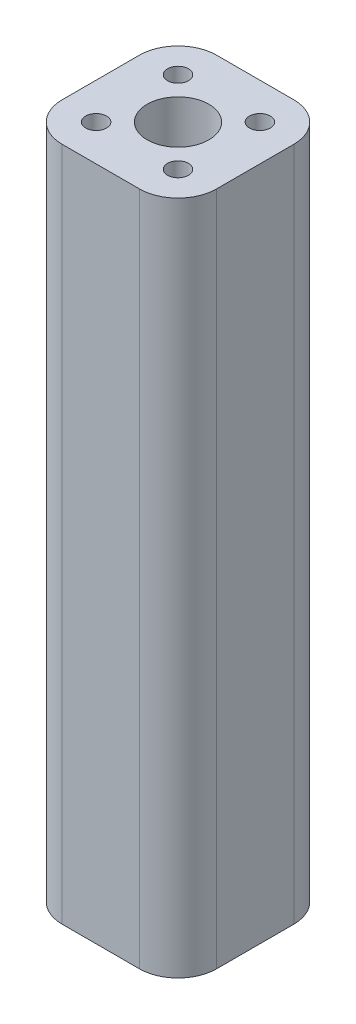
ISO-10303-21;
HEADER;
FILE_DESCRIPTION(('STEP AP214'),'2;1');
FILE_NAME('part.step','',(''),(''),'','','');
FILE_SCHEMA(('AUTOMOTIVE_DESIGN { 1 0 10303 214 1 1 1 1 }'));
ENDSEC;
DATA;
#1=APPLICATION_CONTEXT('core data for automotive mechanical design processes');
#2=APPLICATION_PROTOCOL_DEFINITION('international standard','automotive_design',2000,#1);
#3=PRODUCT_CONTEXT('',#1,'mechanical');
#4=PRODUCT('Part','Part','',(#3));
#5=PRODUCT_RELATED_PRODUCT_CATEGORY('part','',(#4));
#6=PRODUCT_DEFINITION_FORMATION('','',#4);
#7=PRODUCT_DEFINITION_CONTEXT('part definition',#1,'design');
#8=PRODUCT_DEFINITION('design','',#6,#7);
#9=PRODUCT_DEFINITION_SHAPE('','',#8);
#10=(LENGTH_UNIT() NAMED_UNIT(*) SI_UNIT(.MILLI.,.METRE.));
#11=(NAMED_UNIT(*) PLANE_ANGLE_UNIT() SI_UNIT($,.RADIAN.));
#12=(NAMED_UNIT(*) SI_UNIT($,.STERADIAN.) SOLID_ANGLE_UNIT());
#13=UNCERTAINTY_MEASURE_WITH_UNIT(LENGTH_MEASURE(1.E-05),#10,'distance_accuracy_value','');
#14=(GEOMETRIC_REPRESENTATION_CONTEXT(3) GLOBAL_UNCERTAINTY_ASSIGNED_CONTEXT((#13)) GLOBAL_UNIT_ASSIGNED_CONTEXT((#10,
#11,#12)) REPRESENTATION_CONTEXT('',''));
#15=CARTESIAN_POINT('',(0.,0.,0.));
#16=DIRECTION('',(0.,0.,1.));
#17=DIRECTION('',(1.,0.,0.));
#18=AXIS2_PLACEMENT_3D('',#15,#16,#17);
#19=CARTESIAN_POINT('',(0.,175.,0.));
#20=DIRECTION('',(0.,-1.,0.));
#21=DIRECTION('',(0.,0.,-1.));
#22=AXIS2_PLACEMENT_3D('',#19,#20,#21);
#23=PLANE('',#22);
#24=DIRECTION('',(-1.,0.,0.));
#25=VECTOR('',#24,1.);
#26=CARTESIAN_POINT('',(-20.,175.,-20.));
#27=LINE('',#26,#25);
#28=CARTESIAN_POINT('',(9.99999999999999,175.,-20.));
#29=VERTEX_POINT('',#28);
#30=CARTESIAN_POINT('',(-10.,175.,-20.));
#31=VERTEX_POINT('',#30);
#32=EDGE_CURVE('E175',#29,#31,#27,.T.);
#33=ORIENTED_EDGE('',*,*,#32,.T.);
#34=CARTESIAN_POINT('',(-10.,175.,-9.99999999999999));
#35=DIRECTION('',(0.,-1.,0.));
#36=DIRECTION('',(0.,0.,-1.));
#37=AXIS2_PLACEMENT_3D('',#34,#35,#36);
#38=CIRCLE('',#37,10.);
#39=CARTESIAN_POINT('',(-20.,175.,-9.99999999999999));
#40=VERTEX_POINT('',#39);
#41=EDGE_CURVE('E153',#31,#40,#38,.F.);
#42=ORIENTED_EDGE('',*,*,#41,.T.);
#43=DIRECTION('',(0.,0.,1.));
#44=VECTOR('',#43,1.);
#45=CARTESIAN_POINT('',(-20.,175.,20.));
#46=LINE('',#45,#44);
#47=CARTESIAN_POINT('',(-20.,175.,10.));
#48=VERTEX_POINT('',#47);
#49=EDGE_CURVE('E123',#40,#48,#46,.T.);
#50=ORIENTED_EDGE('',*,*,#49,.T.);
#51=CARTESIAN_POINT('',(-10.,175.,10.));
#52=DIRECTION('',(0.,-1.,0.));
#53=DIRECTION('',(0.,0.,-1.));
#54=AXIS2_PLACEMENT_3D('',#51,#52,#53);
#55=CIRCLE('',#54,10.);
#56=CARTESIAN_POINT('',(-10.,175.,20.));
#57=VERTEX_POINT('',#56);
#58=EDGE_CURVE('E59',#48,#57,#55,.F.);
#59=ORIENTED_EDGE('',*,*,#58,.T.);
#60=DIRECTION('',(1.,0.,0.));
#61=VECTOR('',#60,1.);
#62=CARTESIAN_POINT('',(-20.,175.,20.));
#63=LINE('',#62,#61);
#64=CARTESIAN_POINT('',(9.99999999999999,175.,20.));
#65=VERTEX_POINT('',#64);
#66=EDGE_CURVE('E139',#57,#65,#63,.T.);
#67=ORIENTED_EDGE('',*,*,#66,.T.);
#68=CARTESIAN_POINT('',(10.,175.,10.));
#69=DIRECTION('',(0.,-1.,0.));
#70=DIRECTION('',(0.,0.,-1.));
#71=AXIS2_PLACEMENT_3D('',#68,#69,#70);
#72=CIRCLE('',#71,10.);
#73=CARTESIAN_POINT('',(20.,175.,10.));
#74=VERTEX_POINT('',#73);
#75=EDGE_CURVE('E149',#65,#74,#72,.F.);
#76=ORIENTED_EDGE('',*,*,#75,.T.);
#77=DIRECTION('',(0.,0.,-1.));
#78=VECTOR('',#77,1.);
#79=CARTESIAN_POINT('',(20.,175.,20.));
#80=LINE('',#79,#78);
#81=CARTESIAN_POINT('',(20.,175.,-9.99999999999999));
#82=VERTEX_POINT('',#81);
#83=EDGE_CURVE('E133',#74,#82,#80,.T.);
#84=ORIENTED_EDGE('',*,*,#83,.T.);
#85=CARTESIAN_POINT('',(9.99999999999999,175.,-10.));
#86=DIRECTION('',(0.,-1.,0.));
#87=DIRECTION('',(0.,0.,-1.));
#88=AXIS2_PLACEMENT_3D('',#85,#86,#87);
#89=CIRCLE('',#88,10.);
#90=EDGE_CURVE('E151',#82,#29,#89,.F.);
#91=ORIENTED_EDGE('',*,*,#90,.T.);
#92=EDGE_LOOP('',(#33,#42,#50,#59,#67,#76,#84,#91));
#93=FACE_BOUND('',#92,.T.);
#94=CARTESIAN_POINT('',(-10.6066017177982,175.,-10.6066017177982));
#95=DIRECTION('',(0.,1.,0.));
#96=DIRECTION('',(0.,0.,1.));
#97=AXIS2_PLACEMENT_3D('',#94,#95,#96);
#98=CIRCLE('',#97,2.7);
#99=CARTESIAN_POINT('',(-10.6066017177982,175.,-7.90660171779821));
#100=VERTEX_POINT('',#99);
#101=EDGE_CURVE('E184',#100,#100,#98,.T.);
#102=ORIENTED_EDGE('',*,*,#101,.F.);
#103=EDGE_LOOP('',(#102));
#104=FACE_BOUND('',#103,.T.);
#105=CARTESIAN_POINT('',(10.6066017177982,175.,-10.6066017177982));
#106=DIRECTION('',(0.,1.,0.));
#107=DIRECTION('',(0.,0.,1.));
#108=AXIS2_PLACEMENT_3D('',#105,#106,#107);
#109=CIRCLE('',#108,2.7);
#110=CARTESIAN_POINT('',(10.6066017177982,175.,-7.90660171779822));
#111=VERTEX_POINT('',#110);
#112=EDGE_CURVE('E189',#111,#111,#109,.T.);
#113=ORIENTED_EDGE('',*,*,#112,.F.);
#114=EDGE_LOOP('',(#113));
#115=FACE_BOUND('',#114,.T.);
#116=CARTESIAN_POINT('',(10.6066017177982,175.,10.6066017177982));
#117=DIRECTION('',(0.,1.,0.));
#118=DIRECTION('',(0.,0.,1.));
#119=AXIS2_PLACEMENT_3D('',#116,#117,#118);
#120=CIRCLE('',#119,2.7);
#121=CARTESIAN_POINT('',(10.6066017177982,175.,13.3066017177982));
#122=VERTEX_POINT('',#121);
#123=EDGE_CURVE('E194',#122,#122,#120,.T.);
#124=ORIENTED_EDGE('',*,*,#123,.F.);
#125=EDGE_LOOP('',(#124));
#126=FACE_BOUND('',#125,.T.);
#127=CARTESIAN_POINT('',(-10.6066017177982,175.,10.6066017177982));
#128=DIRECTION('',(0.,1.,0.));
#129=DIRECTION('',(0.,0.,1.));
#130=AXIS2_PLACEMENT_3D('',#127,#128,#129);
#131=CIRCLE('',#130,2.7);
#132=CARTESIAN_POINT('',(-10.6066017177982,175.,13.3066017177982));
#133=VERTEX_POINT('',#132);
#134=EDGE_CURVE('E200',#133,#133,#131,.T.);
#135=ORIENTED_EDGE('',*,*,#134,.F.);
#136=EDGE_LOOP('',(#135));
#137=FACE_BOUND('',#136,.T.);
#138=CARTESIAN_POINT('',(0.,175.,0.));
#139=DIRECTION('',(0.,1.,0.));
#140=DIRECTION('',(0.,0.,1.));
#141=AXIS2_PLACEMENT_3D('',#138,#139,#140);
#142=CIRCLE('',#141,8.);
#143=CARTESIAN_POINT('',(0.,175.,8.));
#144=VERTEX_POINT('',#143);
#145=EDGE_CURVE('E206',#144,#144,#142,.T.);
#146=ORIENTED_EDGE('',*,*,#145,.F.);
#147=EDGE_LOOP('',(#146));
#148=FACE_BOUND('',#147,.T.);
#149=ADVANCED_FACE('F39',(#93,#104,#115,#126,#137,#148),#23,.F.);
#150=CARTESIAN_POINT('',(0.,0.,0.));
#151=DIRECTION('',(0.,-1.,0.));
#152=DIRECTION('',(0.,0.,-1.));
#153=AXIS2_PLACEMENT_3D('',#150,#151,#152);
#154=PLANE('',#153);
#155=CARTESIAN_POINT('',(-10.6066017177982,0.,10.6066017177982));
#156=DIRECTION('',(0.,1.,0.));
#157=DIRECTION('',(0.,0.,1.));
#158=AXIS2_PLACEMENT_3D('',#155,#156,#157);
#159=CIRCLE('',#158,2.7);
#160=CARTESIAN_POINT('',(-10.6066017177982,0.,13.3066017177982));
#161=VERTEX_POINT('',#160);
#162=EDGE_CURVE('E203',#161,#161,#159,.T.);
#163=ORIENTED_EDGE('',*,*,#162,.T.);
#164=EDGE_LOOP('',(#163));
#165=FACE_BOUND('',#164,.T.);
#166=CARTESIAN_POINT('',(10.6066017177982,0.,-10.6066017177982));
#167=DIRECTION('',(0.,1.,0.));
#168=DIRECTION('',(0.,0.,1.));
#169=AXIS2_PLACEMENT_3D('',#166,#167,#168);
#170=CIRCLE('',#169,2.7);
#171=CARTESIAN_POINT('',(10.6066017177982,0.,-7.90660171779822));
#172=VERTEX_POINT('',#171);
#173=EDGE_CURVE('E191',#172,#172,#170,.T.);
#174=ORIENTED_EDGE('',*,*,#173,.T.);
#175=EDGE_LOOP('',(#174));
#176=FACE_BOUND('',#175,.T.);
#177=DIRECTION('',(0.,0.,1.));
#178=VECTOR('',#177,1.);
#179=CARTESIAN_POINT('',(-20.,0.,20.));
#180=LINE('',#179,#178);
#181=CARTESIAN_POINT('',(-20.,0.,-9.99999999999999));
#182=VERTEX_POINT('',#181);
#183=CARTESIAN_POINT('',(-20.,0.,10.));
#184=VERTEX_POINT('',#183);
#185=EDGE_CURVE('E121',#182,#184,#180,.T.);
#186=ORIENTED_EDGE('',*,*,#185,.F.);
#187=CARTESIAN_POINT('',(-10.,0.,-9.99999999999999));
#188=DIRECTION('',(0.,-1.,0.));
#189=DIRECTION('',(0.,0.,-1.));
#190=AXIS2_PLACEMENT_3D('',#187,#188,#189);
#191=CIRCLE('',#190,10.);
#192=CARTESIAN_POINT('',(-10.,0.,-20.));
#193=VERTEX_POINT('',#192);
#194=EDGE_CURVE('E104',#182,#193,#191,.T.);
#195=ORIENTED_EDGE('',*,*,#194,.T.);
#196=DIRECTION('',(-1.,0.,0.));
#197=VECTOR('',#196,1.);
#198=CARTESIAN_POINT('',(-20.,0.,-20.));
#199=LINE('',#198,#197);
#200=CARTESIAN_POINT('',(9.99999999999999,0.,-20.));
#201=VERTEX_POINT('',#200);
#202=EDGE_CURVE('E131',#201,#193,#199,.T.);
#203=ORIENTED_EDGE('',*,*,#202,.F.);
#204=CARTESIAN_POINT('',(9.99999999999999,0.,-10.));
#205=DIRECTION('',(0.,-1.,0.));
#206=DIRECTION('',(0.,0.,-1.));
#207=AXIS2_PLACEMENT_3D('',#204,#205,#206);
#208=CIRCLE('',#207,10.);
#209=CARTESIAN_POINT('',(20.,0.,-9.99999999999999));
#210=VERTEX_POINT('',#209);
#211=EDGE_CURVE('E115',#201,#210,#208,.T.);
#212=ORIENTED_EDGE('',*,*,#211,.T.);
#213=DIRECTION('',(0.,0.,-1.));
#214=VECTOR('',#213,1.);
#215=CARTESIAN_POINT('',(20.,0.,20.));
#216=LINE('',#215,#214);
#217=CARTESIAN_POINT('',(20.,0.,10.));
#218=VERTEX_POINT('',#217);
#219=EDGE_CURVE('E135',#218,#210,#216,.T.);
#220=ORIENTED_EDGE('',*,*,#219,.F.);
#221=CARTESIAN_POINT('',(10.,0.,10.));
#222=DIRECTION('',(0.,-1.,0.));
#223=DIRECTION('',(0.,0.,-1.));
#224=AXIS2_PLACEMENT_3D('',#221,#222,#223);
#225=CIRCLE('',#224,10.);
#226=CARTESIAN_POINT('',(9.99999999999999,0.,20.));
#227=VERTEX_POINT('',#226);
#228=EDGE_CURVE('E142',#218,#227,#225,.T.);
#229=ORIENTED_EDGE('',*,*,#228,.T.);
#230=DIRECTION('',(1.,0.,0.));
#231=VECTOR('',#230,1.);
#232=CARTESIAN_POINT('',(-20.,0.,20.));
#233=LINE('',#232,#231);
#234=CARTESIAN_POINT('',(-10.,0.,20.));
#235=VERTEX_POINT('',#234);
#236=EDGE_CURVE('E130',#235,#227,#233,.T.);
#237=ORIENTED_EDGE('',*,*,#236,.F.);
#238=CARTESIAN_POINT('',(-10.,0.,10.));
#239=DIRECTION('',(0.,-1.,0.));
#240=DIRECTION('',(0.,0.,-1.));
#241=AXIS2_PLACEMENT_3D('',#238,#239,#240);
#242=CIRCLE('',#241,10.);
#243=EDGE_CURVE('E124',#235,#184,#242,.T.);
#244=ORIENTED_EDGE('',*,*,#243,.T.);
#245=EDGE_LOOP('',(#186,#195,#203,#212,#220,#229,#237,#244));
#246=FACE_BOUND('',#245,.T.);
#247=CARTESIAN_POINT('',(-10.6066017177982,0.,-10.6066017177982));
#248=DIRECTION('',(0.,1.,0.));
#249=DIRECTION('',(0.,0.,1.));
#250=AXIS2_PLACEMENT_3D('',#247,#248,#249);
#251=CIRCLE('',#250,2.7);
#252=CARTESIAN_POINT('',(-10.6066017177982,0.,-7.90660171779821));
#253=VERTEX_POINT('',#252);
#254=EDGE_CURVE('E180',#253,#253,#251,.T.);
#255=ORIENTED_EDGE('',*,*,#254,.T.);
#256=EDGE_LOOP('',(#255));
#257=FACE_BOUND('',#256,.T.);
#258=CARTESIAN_POINT('',(10.6066017177982,0.,10.6066017177982));
#259=DIRECTION('',(0.,1.,0.));
#260=DIRECTION('',(0.,0.,1.));
#261=AXIS2_PLACEMENT_3D('',#258,#259,#260);
#262=CIRCLE('',#261,2.7);
#263=CARTESIAN_POINT('',(10.6066017177982,0.,13.3066017177982));
#264=VERTEX_POINT('',#263);
#265=EDGE_CURVE('E197',#264,#264,#262,.T.);
#266=ORIENTED_EDGE('',*,*,#265,.T.);
#267=EDGE_LOOP('',(#266));
#268=FACE_BOUND('',#267,.T.);
#269=CARTESIAN_POINT('',(0.,0.,0.));
#270=DIRECTION('',(0.,1.,0.));
#271=DIRECTION('',(0.,0.,1.));
#272=AXIS2_PLACEMENT_3D('',#269,#270,#271);
#273=CIRCLE('',#272,8.);
#274=CARTESIAN_POINT('',(0.,0.,8.));
#275=VERTEX_POINT('',#274);
#276=EDGE_CURVE('E209',#275,#275,#273,.T.);
#277=ORIENTED_EDGE('',*,*,#276,.T.);
#278=EDGE_LOOP('',(#277));
#279=FACE_BOUND('',#278,.T.);
#280=ADVANCED_FACE('F127',(#165,#176,#246,#257,#268,#279),#154,.T.);
#281=CARTESIAN_POINT('',(20.,175.,20.));
#282=DIRECTION('',(-1.,0.,0.));
#283=DIRECTION('',(0.,0.,1.));
#284=AXIS2_PLACEMENT_3D('',#281,#282,#283);
#285=PLANE('',#284);
#286=ORIENTED_EDGE('',*,*,#219,.T.);
#287=DIRECTION('',(0.,-1.,0.));
#288=VECTOR('',#287,1.);
#289=CARTESIAN_POINT('',(20.,175.,-9.99999999999999));
#290=LINE('',#289,#288);
#291=EDGE_CURVE('E158',#210,#82,#290,.F.);
#292=ORIENTED_EDGE('',*,*,#291,.T.);
#293=ORIENTED_EDGE('',*,*,#83,.F.);
#294=DIRECTION('',(0.,-1.,0.));
#295=VECTOR('',#294,1.);
#296=CARTESIAN_POINT('',(20.,175.,10.));
#297=LINE('',#296,#295);
#298=EDGE_CURVE('E155',#74,#218,#297,.T.);
#299=ORIENTED_EDGE('',*,*,#298,.T.);
#300=EDGE_LOOP('',(#286,#292,#293,#299));
#301=FACE_BOUND('',#300,.T.);
#302=ADVANCED_FACE('F171',(#301),#285,.F.);
#303=CARTESIAN_POINT('',(-20.,175.,-20.));
#304=DIRECTION('',(0.,0.,1.));
#305=DIRECTION('',(1.,0.,0.));
#306=AXIS2_PLACEMENT_3D('',#303,#304,#305);
#307=PLANE('',#306);
#308=ORIENTED_EDGE('',*,*,#202,.T.);
#309=DIRECTION('',(0.,-1.,0.));
#310=VECTOR('',#309,1.);
#311=CARTESIAN_POINT('',(-10.,175.,-20.));
#312=LINE('',#311,#310);
#313=EDGE_CURVE('E109',#193,#31,#312,.F.);
#314=ORIENTED_EDGE('',*,*,#313,.T.);
#315=ORIENTED_EDGE('',*,*,#32,.F.);
#316=DIRECTION('',(0.,-1.,0.));
#317=VECTOR('',#316,1.);
#318=CARTESIAN_POINT('',(9.99999999999999,175.,-20.));
#319=LINE('',#318,#317);
#320=EDGE_CURVE('E114',#29,#201,#319,.T.);
#321=ORIENTED_EDGE('',*,*,#320,.T.);
#322=EDGE_LOOP('',(#308,#314,#315,#321));
#323=FACE_BOUND('',#322,.T.);
#324=ADVANCED_FACE('F235',(#323),#307,.F.);
#325=CARTESIAN_POINT('',(-20.,175.,20.));
#326=DIRECTION('',(1.,0.,0.));
#327=DIRECTION('',(0.,0.,-1.));
#328=AXIS2_PLACEMENT_3D('',#325,#326,#327);
#329=PLANE('',#328);
#330=ORIENTED_EDGE('',*,*,#49,.F.);
#331=DIRECTION('',(0.,-1.,0.));
#332=VECTOR('',#331,1.);
#333=CARTESIAN_POINT('',(-20.,175.,-9.99999999999999));
#334=LINE('',#333,#332);
#335=EDGE_CURVE('E108',#40,#182,#334,.T.);
#336=ORIENTED_EDGE('',*,*,#335,.T.);
#337=ORIENTED_EDGE('',*,*,#185,.T.);
#338=DIRECTION('',(0.,-1.,0.));
#339=VECTOR('',#338,1.);
#340=CARTESIAN_POINT('',(-20.,175.,10.));
#341=LINE('',#340,#339);
#342=EDGE_CURVE('E125',#184,#48,#341,.F.);
#343=ORIENTED_EDGE('',*,*,#342,.T.);
#344=EDGE_LOOP('',(#330,#336,#337,#343));
#345=FACE_BOUND('',#344,.T.);
#346=ADVANCED_FACE('F120',(#345),#329,.F.);
#347=CARTESIAN_POINT('',(-20.,175.,20.));
#348=DIRECTION('',(0.,0.,-1.));
#349=DIRECTION('',(-1.,0.,0.));
#350=AXIS2_PLACEMENT_3D('',#347,#348,#349);
#351=PLANE('',#350);
#352=ORIENTED_EDGE('',*,*,#236,.T.);
#353=DIRECTION('',(0.,-1.,0.));
#354=VECTOR('',#353,1.);
#355=CARTESIAN_POINT('',(9.99999999999999,175.,20.));
#356=LINE('',#355,#354);
#357=EDGE_CURVE('E11',#227,#65,#356,.F.);
#358=ORIENTED_EDGE('',*,*,#357,.T.);
#359=ORIENTED_EDGE('',*,*,#66,.F.);
#360=DIRECTION('',(0.,-1.,0.));
#361=VECTOR('',#360,1.);
#362=CARTESIAN_POINT('',(-10.,175.,20.));
#363=LINE('',#362,#361);
#364=EDGE_CURVE('E47',#57,#235,#363,.T.);
#365=ORIENTED_EDGE('',*,*,#364,.T.);
#366=EDGE_LOOP('',(#352,#358,#359,#365));
#367=FACE_BOUND('',#366,.T.);
#368=ADVANCED_FACE('F161',(#367),#351,.F.);
#369=CARTESIAN_POINT('',(-10.6066017177982,175.,-10.6066017177982));
#370=DIRECTION('',(0.,-1.,0.));
#371=DIRECTION('',(0.,0.,-1.));
#372=AXIS2_PLACEMENT_3D('',#369,#370,#371);
#373=CYLINDRICAL_SURFACE('',#372,2.7);
#374=ORIENTED_EDGE('',*,*,#101,.T.);
#375=EDGE_LOOP('',(#374));
#376=FACE_BOUND('',#375,.T.);
#377=ORIENTED_EDGE('',*,*,#254,.F.);
#378=EDGE_LOOP('',(#377));
#379=FACE_BOUND('',#378,.T.);
#380=ADVANCED_FACE('F228',(#376,#379),#373,.F.);
#381=CARTESIAN_POINT('',(10.6066017177982,175.,-10.6066017177982));
#382=DIRECTION('',(0.,-1.,0.));
#383=DIRECTION('',(0.,0.,-1.));
#384=AXIS2_PLACEMENT_3D('',#381,#382,#383);
#385=CYLINDRICAL_SURFACE('',#384,2.7);
#386=ORIENTED_EDGE('',*,*,#112,.T.);
#387=EDGE_LOOP('',(#386));
#388=FACE_BOUND('',#387,.T.);
#389=ORIENTED_EDGE('',*,*,#173,.F.);
#390=EDGE_LOOP('',(#389));
#391=FACE_BOUND('',#390,.T.);
#392=ADVANCED_FACE('F298',(#388,#391),#385,.F.);
#393=CARTESIAN_POINT('',(10.6066017177982,175.,10.6066017177982));
#394=DIRECTION('',(0.,-1.,0.));
#395=DIRECTION('',(0.,0.,-1.));
#396=AXIS2_PLACEMENT_3D('',#393,#394,#395);
#397=CYLINDRICAL_SURFACE('',#396,2.7);
#398=ORIENTED_EDGE('',*,*,#123,.T.);
#399=EDGE_LOOP('',(#398));
#400=FACE_BOUND('',#399,.T.);
#401=ORIENTED_EDGE('',*,*,#265,.F.);
#402=EDGE_LOOP('',(#401));
#403=FACE_BOUND('',#402,.T.);
#404=ADVANCED_FACE('F288',(#400,#403),#397,.F.);
#405=CARTESIAN_POINT('',(-10.6066017177982,175.,10.6066017177982));
#406=DIRECTION('',(0.,-1.,0.));
#407=DIRECTION('',(0.,0.,-1.));
#408=AXIS2_PLACEMENT_3D('',#405,#406,#407);
#409=CYLINDRICAL_SURFACE('',#408,2.7);
#410=ORIENTED_EDGE('',*,*,#134,.T.);
#411=EDGE_LOOP('',(#410));
#412=FACE_BOUND('',#411,.T.);
#413=ORIENTED_EDGE('',*,*,#162,.F.);
#414=EDGE_LOOP('',(#413));
#415=FACE_BOUND('',#414,.T.);
#416=ADVANCED_FACE('F279',(#412,#415),#409,.F.);
#417=CARTESIAN_POINT('',(0.,175.,0.));
#418=DIRECTION('',(0.,-1.,0.));
#419=DIRECTION('',(0.,0.,-1.));
#420=AXIS2_PLACEMENT_3D('',#417,#418,#419);
#421=CYLINDRICAL_SURFACE('',#420,8.);
#422=ORIENTED_EDGE('',*,*,#145,.T.);
#423=EDGE_LOOP('',(#422));
#424=FACE_BOUND('',#423,.T.);
#425=ORIENTED_EDGE('',*,*,#276,.F.);
#426=EDGE_LOOP('',(#425));
#427=FACE_BOUND('',#426,.T.);
#428=ADVANCED_FACE('F215',(#424,#427),#421,.F.);
#429=CARTESIAN_POINT('',(-10.,175.,-9.99999999999999));
#430=DIRECTION('',(0.,-1.,0.));
#431=DIRECTION('',(0.,0.,-1.));
#432=AXIS2_PLACEMENT_3D('',#429,#430,#431);
#433=CYLINDRICAL_SURFACE('',#432,10.);
#434=ORIENTED_EDGE('',*,*,#41,.F.);
#435=ORIENTED_EDGE('',*,*,#313,.F.);
#436=ORIENTED_EDGE('',*,*,#194,.F.);
#437=ORIENTED_EDGE('',*,*,#335,.F.);
#438=EDGE_LOOP('',(#434,#435,#436,#437));
#439=FACE_BOUND('',#438,.T.);
#440=ADVANCED_FACE('F107',(#439),#433,.T.);
#441=CARTESIAN_POINT('',(9.99999999999999,175.,-10.));
#442=DIRECTION('',(0.,-1.,0.));
#443=DIRECTION('',(0.,0.,-1.));
#444=AXIS2_PLACEMENT_3D('',#441,#442,#443);
#445=CYLINDRICAL_SURFACE('',#444,10.);
#446=ORIENTED_EDGE('',*,*,#90,.F.);
#447=ORIENTED_EDGE('',*,*,#291,.F.);
#448=ORIENTED_EDGE('',*,*,#211,.F.);
#449=ORIENTED_EDGE('',*,*,#320,.F.);
#450=EDGE_LOOP('',(#446,#447,#448,#449));
#451=FACE_BOUND('',#450,.T.);
#452=ADVANCED_FACE('F243',(#451),#445,.T.);
#453=CARTESIAN_POINT('',(10.,175.,10.));
#454=DIRECTION('',(0.,-1.,0.));
#455=DIRECTION('',(0.,0.,-1.));
#456=AXIS2_PLACEMENT_3D('',#453,#454,#455);
#457=CYLINDRICAL_SURFACE('',#456,10.);
#458=ORIENTED_EDGE('',*,*,#75,.F.);
#459=ORIENTED_EDGE('',*,*,#357,.F.);
#460=ORIENTED_EDGE('',*,*,#228,.F.);
#461=ORIENTED_EDGE('',*,*,#298,.F.);
#462=EDGE_LOOP('',(#458,#459,#460,#461));
#463=FACE_BOUND('',#462,.T.);
#464=ADVANCED_FACE('F168',(#463),#457,.T.);
#465=CARTESIAN_POINT('',(-10.,175.,10.));
#466=DIRECTION('',(0.,-1.,0.));
#467=DIRECTION('',(0.,0.,-1.));
#468=AXIS2_PLACEMENT_3D('',#465,#466,#467);
#469=CYLINDRICAL_SURFACE('',#468,10.);
#470=ORIENTED_EDGE('',*,*,#58,.F.);
#471=ORIENTED_EDGE('',*,*,#342,.F.);
#472=ORIENTED_EDGE('',*,*,#243,.F.);
#473=ORIENTED_EDGE('',*,*,#364,.F.);
#474=EDGE_LOOP('',(#470,#471,#472,#473));
#475=FACE_BOUND('',#474,.T.);
#476=ADVANCED_FACE('F41',(#475),#469,.T.);
#477=CLOSED_SHELL('',(#149,#280,#302,#324,#346,#368,#380,#392,#404,#416,#428,#440,#452,#464,#476));
#478=MANIFOLD_SOLID_BREP('B2',#477);
#479=ADVANCED_BREP_SHAPE_REPRESENTATION('',(#18,#478),#14);
#480=SHAPE_DEFINITION_REPRESENTATION(#9,#479);
ENDSEC;
END-ISO-10303-21;
